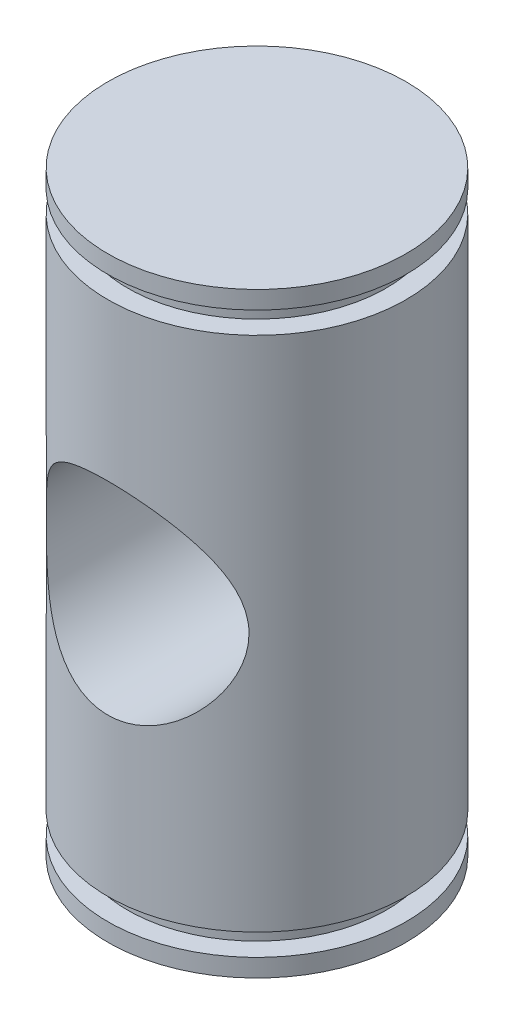
ISO-10303-21;
HEADER;
FILE_DESCRIPTION(('STEP AP214'),'2;1');
FILE_NAME('part.step','',(''),(''),'','','');
FILE_SCHEMA(('AUTOMOTIVE_DESIGN { 1 0 10303 214 1 1 1 1 }'));
ENDSEC;
DATA;
#1=APPLICATION_CONTEXT('core data for automotive mechanical design processes');
#2=APPLICATION_PROTOCOL_DEFINITION('international standard','automotive_design',2000,#1);
#3=PRODUCT_CONTEXT('',#1,'mechanical');
#4=PRODUCT('Part','Part','',(#3));
#5=PRODUCT_RELATED_PRODUCT_CATEGORY('part','',(#4));
#6=PRODUCT_DEFINITION_FORMATION('','',#4);
#7=PRODUCT_DEFINITION_CONTEXT('part definition',#1,'design');
#8=PRODUCT_DEFINITION('design','',#6,#7);
#9=PRODUCT_DEFINITION_SHAPE('','',#8);
#10=(LENGTH_UNIT() NAMED_UNIT(*) SI_UNIT(.MILLI.,.METRE.));
#11=(NAMED_UNIT(*) PLANE_ANGLE_UNIT() SI_UNIT($,.RADIAN.));
#12=(NAMED_UNIT(*) SI_UNIT($,.STERADIAN.) SOLID_ANGLE_UNIT());
#13=UNCERTAINTY_MEASURE_WITH_UNIT(LENGTH_MEASURE(1.E-05),#10,'distance_accuracy_value','');
#14=(GEOMETRIC_REPRESENTATION_CONTEXT(3) GLOBAL_UNCERTAINTY_ASSIGNED_CONTEXT((#13)) GLOBAL_UNIT_ASSIGNED_CONTEXT((#10,
#11,#12)) REPRESENTATION_CONTEXT('',''));
#15=CARTESIAN_POINT('',(0.,0.,0.));
#16=DIRECTION('',(0.,0.,1.));
#17=DIRECTION('',(1.,0.,0.));
#18=AXIS2_PLACEMENT_3D('',#15,#16,#17);
#19=CARTESIAN_POINT('',(0.,24.,0.));
#20=DIRECTION('',(0.,-1.,0.));
#21=DIRECTION('',(0.,0.,-1.));
#22=AXIS2_PLACEMENT_3D('',#19,#20,#21);
#23=CYLINDRICAL_SURFACE('',#22,7.5);
#24=CARTESIAN_POINT('',(0.,17.1,-7.5));
#25=CARTESIAN_POINT('',(-0.127566730210158,17.0999994927697,-7.4999995232582));
#26=CARTESIAN_POINT('',(-0.255141212777439,17.0952067984768,-7.49673811939733));
#27=CARTESIAN_POINT('',(-0.509248840360519,17.0761111027231,-7.48377281472617));
#28=CARTESIAN_POINT('',(-0.635781903448471,17.0618073601383,-7.47406841186195));
#29=CARTESIAN_POINT('',(-0.886852602958205,17.0239045221269,-7.4484509526827));
#30=CARTESIAN_POINT('',(-1.01138950096724,17.0003020659397,-7.43253565163154));
#31=CARTESIAN_POINT('',(-1.25756849452188,16.9441350534012,-7.39486565882096));
#32=CARTESIAN_POINT('',(-1.37920936892341,16.9115667867568,-7.37310854965662));
#33=CARTESIAN_POINT('',(-1.61812798463224,16.838098298266,-7.32437318225181));
#34=CARTESIAN_POINT('',(-1.73542563216593,16.7972437126043,-7.29742356034956));
#35=CARTESIAN_POINT('',(-1.96573111337874,16.7075676353014,-7.23878773296998));
#36=CARTESIAN_POINT('',(-2.07873725088865,16.6587430331807,-7.20709967861906));
#37=CARTESIAN_POINT('',(-2.41041806838491,16.5010806974564,-7.1058561150041));
#38=CARTESIAN_POINT('',(-2.62196918942367,16.3809875400407,-7.03007586157716));
#39=CARTESIAN_POINT('',(-3.04015450725819,16.1031629847138,-6.86023456785428));
#40=CARTESIAN_POINT('',(-3.2447875004321,15.9430772904534,-6.76516011965005));
#41=CARTESIAN_POINT('',(-3.62626002576161,15.595404388787,-6.56858301036921));
#42=CARTESIAN_POINT('',(-3.80305812367292,15.4077769709468,-6.46707107589219));
#43=CARTESIAN_POINT('',(-4.05915220570279,15.0912371470647,-6.30758792049528));
#44=CARTESIAN_POINT('',(-4.14836195548589,14.970469609277,-6.24911315974463));
#45=CARTESIAN_POINT('',(-4.31622565963556,14.7208181640917,-6.13437409208585));
#46=CARTESIAN_POINT('',(-4.39487707912488,14.5919323184984,-6.07811031828343));
#47=CARTESIAN_POINT('',(-4.61393463355384,14.1938808227036,-5.91561181692743));
#48=CARTESIAN_POINT('',(-4.73796392687913,13.9126829194577,-5.81532969123793));
#49=CARTESIAN_POINT('',(-4.90568631373639,13.4112715647167,-5.6738535566743));
#50=CARTESIAN_POINT('',(-4.96230524005851,13.1978552916999,-5.62395673680471));
#51=CARTESIAN_POINT('',(-5.02634150626474,12.8707770584797,-5.56656756646093));
#52=CARTESIAN_POINT('',(-5.04420235416821,12.7606310641808,-5.55034976483986));
#53=CARTESIAN_POINT('',(-5.07270410383868,12.5386778797341,-5.52431518380449));
#54=CARTESIAN_POINT('',(-5.08334766221265,12.426871316327,-5.51449604916135));
#55=CARTESIAN_POINT('',(-5.09725701763249,12.2018485591129,-5.50164158369271));
#56=CARTESIAN_POINT('',(-5.10048585617087,12.0886281200459,-5.49864023677857));
#57=CARTESIAN_POINT('',(-5.09939588911292,11.8622558721054,-5.49965110286675));
#58=CARTESIAN_POINT('',(-5.09507708047514,11.7491040632596,-5.50366331869529));
#59=CARTESIAN_POINT('',(-5.07897051252735,11.5237401243872,-5.51853045455466));
#60=CARTESIAN_POINT('',(-5.06717957560727,11.4115284147291,-5.52938828575355));
#61=CARTESIAN_POINT('',(-5.03634428460785,11.1888982139649,-5.55748709063105));
#62=CARTESIAN_POINT('',(-5.01729689957282,11.0784804923136,-5.57473073152304));
#63=CARTESIAN_POINT('',(-4.95209879014997,10.7625846806445,-5.63294148366203));
#64=CARTESIAN_POINT('',(-4.89693365040974,10.5602635141615,-5.68134319155892));
#65=CARTESIAN_POINT('',(-4.7639995139934,10.1676774097148,-5.79325354551575));
#66=CARTESIAN_POINT('',(-4.68621300254279,9.97742195328287,-5.85677389035357));
#67=CARTESIAN_POINT('',(-4.5326114762077,9.65726362028585,-5.97598027806196));
#68=CARTESIAN_POINT('',(-4.46134624038017,9.52433679281399,-6.02953727773034));
#69=CARTESIAN_POINT('',(-4.30806334839154,9.26630091753426,-6.13999251867954));
#70=CARTESIAN_POINT('',(-4.22604553958328,9.14119198074904,-6.19689080738809));
#71=CARTESIAN_POINT('',(-4.05159509981907,8.89888641538432,-6.31233240965471));
#72=CARTESIAN_POINT('',(-3.95914363036821,8.78170473003148,-6.37087855073661));
#73=CARTESIAN_POINT('',(-3.76433311330421,8.55587026169253,-6.48788915816264));
#74=CARTESIAN_POINT('',(-3.66197522745005,8.4472164813101,-6.54635363327024));
#75=CARTESIAN_POINT('',(-3.44671491383834,8.23796799070864,-6.66222409680994));
#76=CARTESIAN_POINT('',(-3.33372690448862,8.13745343281274,-6.71961607151097));
#77=CARTESIAN_POINT('',(-3.09835160633043,7.94621117557695,-6.83133836098213));
#78=CARTESIAN_POINT('',(-2.9759655286723,7.85548221875608,-6.88566906870529));
#79=CARTESIAN_POINT('',(-2.72244284072097,7.68472214908,-6.98978199090739));
#80=CARTESIAN_POINT('',(-2.59132125182581,7.60467334819017,-7.03957168163614));
#81=CARTESIAN_POINT('',(-2.32078317136895,7.45601850488418,-7.13333310693482));
#82=CARTESIAN_POINT('',(-2.18136919217295,7.38740902038798,-7.17730659076999));
#83=CARTESIAN_POINT('',(-1.92686478635842,7.27644574996576,-7.24917926671467));
#84=CARTESIAN_POINT('',(-1.81323196464627,7.23164305034019,-7.27848099281239));
#85=CARTESIAN_POINT('',(-1.58202053924471,7.15002755014502,-7.33220894429242));
#86=CARTESIAN_POINT('',(-1.46444271393283,7.1132131839998,-7.35663612492606));
#87=CARTESIAN_POINT('',(-1.2260224606973,7.04801671254319,-7.40010461124119));
#88=CARTESIAN_POINT('',(-1.10518081384602,7.01963260893451,-7.4191471932288));
#89=CARTESIAN_POINT('',(-0.861049766239558,6.97167430400485,-7.45142567103361));
#90=CARTESIAN_POINT('',(-0.737761512955199,6.9520960700932,-7.46466422469749));
#91=CARTESIAN_POINT('',(-0.489101139016054,6.92195665297877,-7.48507852394856));
#92=CARTESIAN_POINT('',(-0.3637228290406,6.91143042612677,-7.49223076477686));
#93=CARTESIAN_POINT('',(-0.1123754220696,6.89968688450283,-7.50021167992905));
#94=CARTESIAN_POINT('',(0.0135934372558473,6.89846610083628,-7.50104271068121));
#95=CARTESIAN_POINT('',(0.265186676100003,6.90534433395875,-7.4963664539054));
#96=CARTESIAN_POINT('',(0.390810968234129,6.91344552884663,-7.49085768507059));
#97=CARTESIAN_POINT('',(0.640689350550038,6.93884502062835,-7.47363385631711));
#98=CARTESIAN_POINT('',(0.764943474166071,6.95614309259487,-7.46191894818155));
#99=CARTESIAN_POINT('',(1.00457509422583,6.99851724611934,-7.43334366115526));
#100=CARTESIAN_POINT('',(1.12007206994069,7.02312818610106,-7.41679176809096));
#101=CARTESIAN_POINT('',(1.34832722668319,7.08005389476483,-7.37871447292753));
#102=CARTESIAN_POINT('',(1.4610845052842,7.11237116491677,-7.35718745597641));
#103=CARTESIAN_POINT('',(1.79423202227296,7.22034229656798,-7.28575148830959));
#104=CARTESIAN_POINT('',(2.00968263945377,7.30704881960708,-7.22896465089334));
#105=CARTESIAN_POINT('',(2.4399679186831,7.51466318840058,-7.09587153167287));
#106=CARTESIAN_POINT('',(2.65335288012816,7.63776461845217,-7.01836077021799));
#107=CARTESIAN_POINT('',(3.05740511094924,7.91077141145693,-6.85201208837707));
#108=CARTESIAN_POINT('',(3.24805485777835,8.06069722889869,-6.7631655390122));
#109=CARTESIAN_POINT('',(3.63478077583375,8.41147301601969,-6.56453831392151));
#110=CARTESIAN_POINT('',(3.82641745045037,8.61664641906045,-6.45374379836046));
#111=CARTESIAN_POINT('',(4.17422098061933,9.05644400991991,-6.23443119554039));
#112=CARTESIAN_POINT('',(4.33037238922449,9.29108095465659,-6.12591411824859));
#113=CARTESIAN_POINT('',(4.58482403610952,9.75302960471253,-5.9372457430984));
#114=CARTESIAN_POINT('',(4.68815464405302,9.97680165307353,-5.85524903904975));
#115=CARTESIAN_POINT('',(4.86267572421545,10.4424665471858,-5.71115225734429));
#116=CARTESIAN_POINT('',(4.93392934581856,10.68432268619,-5.64901315701445));
#117=CARTESIAN_POINT('',(5.03156854501574,11.140681329729,-5.56209598200348));
#118=CARTESIAN_POINT('',(5.06340445355703,11.3531444724245,-5.53285535125835));
#119=CARTESIAN_POINT('',(5.09988778893923,11.7822799319448,-5.49925644490971));
#120=CARTESIAN_POINT('',(5.10455931238198,11.9989483471487,-5.4948761166604));
#121=CARTESIAN_POINT('',(5.08641912798999,12.4299553903438,-5.5116655050053));
#122=CARTESIAN_POINT('',(5.06362306205283,12.6442952742483,-5.53282067997419));
#123=CARTESIAN_POINT('',(4.9921021040988,13.0652051747589,-5.59742600224665));
#124=CARTESIAN_POINT('',(4.94334083165103,13.2717638530683,-5.64090742829697));
#125=CARTESIAN_POINT('',(4.80282149517219,13.7376921740086,-5.76141317263775));
#126=CARTESIAN_POINT('',(4.7022965389055,13.9928024854154,-5.84471923848015));
#127=CARTESIAN_POINT('',(4.52457953123839,14.3572337216815,-5.9819577215412));
#128=CARTESIAN_POINT('',(4.46076408829201,14.4757964941017,-6.02981203769062));
#129=CARTESIAN_POINT('',(4.32455180446817,14.7066956348769,-6.12823980727697));
#130=CARTESIAN_POINT('',(4.25215554883238,14.8190324270998,-6.1788130751434));
#131=CARTESIAN_POINT('',(4.01951211467638,15.150784897828,-6.33472141245388));
#132=CARTESIAN_POINT('',(3.84613599811439,15.3601959243096,-6.44236319615055));
#133=CARTESIAN_POINT('',(3.56225107692574,15.6522349841064,-6.60092483364332));
#134=CARTESIAN_POINT('',(3.46360063950101,15.7459406248371,-6.65331916343599));
#135=CARTESIAN_POINT('',(3.2584829665125,15.9256688537068,-6.75613988557255));
#136=CARTESIAN_POINT('',(3.15201453666973,16.0116902635329,-6.806565975438));
#137=CARTESIAN_POINT('',(2.9176396223219,16.1858459656964,-6.91055951982317));
#138=CARTESIAN_POINT('',(2.78872465801304,16.2728720757396,-6.96371795172151));
#139=CARTESIAN_POINT('',(2.52199109677087,16.435531807046,-7.06469244234633));
#140=CARTESIAN_POINT('',(2.38417684656728,16.5111709308708,-7.1125110785319));
#141=CARTESIAN_POINT('',(2.10056999736255,16.6499996164635,-7.20136490911293));
#142=CARTESIAN_POINT('',(1.95478895369255,16.7132066283411,-7.24240959841606));
#143=CARTESIAN_POINT('',(1.65618900681344,16.8262293190255,-7.31646529620441));
#144=CARTESIAN_POINT('',(1.50337339292219,16.876051183611,-7.34948001497008));
#145=CARTESIAN_POINT('',(1.23920976098486,16.9484387513939,-7.3977402294092));
#146=CARTESIAN_POINT('',(1.12928530756659,16.9746913370418,-7.41534055427439));
#147=CARTESIAN_POINT('',(0.907305677180581,17.0199220703817,-7.44575957877726));
#148=CARTESIAN_POINT('',(0.795250909775432,17.0389016017997,-7.45857918795177));
#149=CARTESIAN_POINT('',(0.569687947034436,17.06935947108,-7.47918978594514));
#150=CARTESIAN_POINT('',(0.456180023284695,17.0808391903326,-7.48698170081165));
#151=CARTESIAN_POINT('',(0.228449982132238,17.0961584885706,-7.49738621232472));
#152=CARTESIAN_POINT('',(0.114228099021864,17.1000004541933,-7.50000042689272));
#153=CARTESIAN_POINT('',(0.,17.1,-7.5));
#154=B_SPLINE_CURVE_WITH_KNOTS('',3,(#24,#25,#26,#27,#28,#29,#30,#31,#32,#33,#34,#35,#36,#37,
#38,#39,#40,#41,#42,#43,#44,#45,#46,#47,#48,#49,#50,#51,#52,#53,#54,#55,#56,#57,#58,#59,#60,#61,
#62,#63,#64,#65,#66,#67,#68,#69,#70,#71,#72,#73,#74,#75,#76,#77,#78,#79,#80,#81,#82,#83,#84,#85,
#86,#87,#88,#89,#90,#91,#92,#93,#94,#95,#96,#97,#98,#99,#100,#101,#102,#103,#104,#105,#106,#107,
#108,#109,#110,#111,#112,#113,#114,#115,#116,#117,#118,#119,#120,#121,#122,#123,#124,#125,#126,
#127,#128,#129,#130,#131,#132,#133,#134,#135,#136,#137,#138,#139,#140,#141,#142,#143,#144,#145,
#146,#147,#148,#149,#150,#151,#152,#153),.UNSPECIFIED.,.T.,.F.,(4,2,2,2,2,2,2,2,2,2,2,2,2,2,2,2,
2,2,2,2,2,2,2,2,2,2,2,2,2,2,2,2,2,2,2,2,2,2,2,2,2,2,2,2,2,2,2,2,2,2,2,2,2,2,2,2,2,2,2,2,2,2,2,2,
4),(0.,0.382583141590157,0.765196098475823,1.14794746718391,1.53085746740599,1.91171325139345,
2.29271802991108,3.05404881937724,3.88110644920519,4.70938380510365,5.19224676493767,
5.67522544549461,6.6385431192422,7.31480074218911,7.65269734240483,7.99046949888721,
8.32992165255371,8.66937394300727,9.00897068648304,9.34870943238132,9.99181269480681,
10.6354152167206,11.1149939965721,11.5945795854236,12.075045378313,12.5554548934715,
13.0401314046674,13.5247455589917,14.0085468796975,14.4922023612675,14.8686596106289,
15.2450430140901,15.6213371288376,15.9974587462582,16.3750264013722,16.7524532994625,
17.1299684020085,17.5074742721206,17.8648029217323,18.2222477182658,18.9365764227754,
19.7084883030172,20.480991320035,21.3828820588251,22.2851646471648,23.0616496952177,
23.836599333631,24.4841536925998,25.1311335403942,25.7777451282984,26.4252650912416,
27.2800504095095,27.7084209656309,28.1367623221647,29.0101153906508,29.4472032329206,
29.8843579843313,30.3767889095179,30.8689811069411,31.3604774386671,31.8517462392528,
32.1945612285007,32.537310963476,32.8799975495719,33.2225770364777),.UNSPECIFIED.);
#155=CARTESIAN_POINT('',(0.,17.1,-7.5));
#156=VERTEX_POINT('',#155);
#157=EDGE_CURVE('E10',#156,#156,#154,.T.);
#158=ORIENTED_EDGE('',*,*,#157,.T.);
#159=EDGE_LOOP('',(#158));
#160=FACE_BOUND('',#159,.T.);
#161=CARTESIAN_POINT('',(5.1,12.,5.49909083394701));
#162=CARTESIAN_POINT('',(5.10000460461227,11.8763135565414,5.49908269677092));
#163=CARTESIAN_POINT('',(5.09549411689311,11.7526635055115,5.50327898444734));
#164=CARTESIAN_POINT('',(5.07756787972817,11.5065196431349,5.51982446461906));
#165=CARTESIAN_POINT('',(5.06414971947728,11.3840261539094,5.53217586423881));
#166=CARTESIAN_POINT('',(5.02866183095179,11.1411331571149,5.56445222653675));
#167=CARTESIAN_POINT('',(5.0065788304413,11.0207371592283,5.58438880626913));
#168=CARTESIAN_POINT('',(4.95417519863365,10.7830435453275,5.63093014513941));
#169=CARTESIAN_POINT('',(4.92385021026666,10.6657476042257,5.6575384306505));
#170=CARTESIAN_POINT('',(4.82193417733257,10.3220314675793,5.74516411271));
#171=CARTESIAN_POINT('',(4.73897468950654,10.1009753563163,5.81439847219608));
#172=CARTESIAN_POINT('',(4.54597378607742,9.67649792883648,5.96650691751471));
#173=CARTESIAN_POINT('',(4.43592842680086,9.47307918643893,6.04938298898316));
#174=CARTESIAN_POINT('',(4.17091115618131,9.05301058696962,6.2356846586459));
#175=CARTESIAN_POINT('',(4.01153860941633,8.83961693658783,6.34025688922267));
#176=CARTESIAN_POINT('',(3.74907233737706,8.53992390829499,6.49653064030007));
#177=CARTESIAN_POINT('',(3.65759459137233,8.44335241241974,6.54856844526537));
#178=CARTESIAN_POINT('',(3.46697680729689,8.25729950823859,6.651449826628));
#179=CARTESIAN_POINT('',(3.36783515028412,8.16781960610648,6.70229314772585));
#180=CARTESIAN_POINT('',(3.14634256277193,7.98323698344429,6.80939800662233));
#181=CARTESIAN_POINT('',(3.02276671293973,7.88938464652511,6.86529086034837));
#182=CARTESIAN_POINT('',(2.766284941118,7.71258695644353,6.97258762426064));
#183=CARTESIAN_POINT('',(2.63338315789852,7.62963681135302,7.02399350328323));
#184=CARTESIAN_POINT('',(2.35900211472256,7.47564063371347,7.1208320283892));
#185=CARTESIAN_POINT('',(2.21753346180748,7.4045802743026,7.16627184897662));
#186=CARTESIAN_POINT('',(1.92680146304984,7.27530770655076,7.24984718671696));
#187=CARTESIAN_POINT('',(1.77754128399093,7.2170903278271,7.28798564246452));
#188=CARTESIAN_POINT('',(1.51164511066682,7.12770633409001,7.34700154664027));
#189=CARTESIAN_POINT('',(1.39646876529493,7.09343193806145,7.36979682983633));
#190=CARTESIAN_POINT('',(1.16313581876349,7.03294540475093,7.41020399483566));
#191=CARTESIAN_POINT('',(1.04497981746517,7.0067316585078,7.42781691104471));
#192=CARTESIAN_POINT('',(0.806495398035895,6.96271304613387,7.45747917390487));
#193=CARTESIAN_POINT('',(0.686168345533104,6.94490307304086,7.46953189937708));
#194=CARTESIAN_POINT('',(0.444103461720726,6.91791360802607,7.48782367043018));
#195=CARTESIAN_POINT('',(0.322365583783978,6.90873440217554,7.4940625233072));
#196=CARTESIAN_POINT('',(0.0781978918972981,6.89913388085577,7.50058815404189));
#197=CARTESIAN_POINT('',(-0.0442326950635858,6.89872596789607,7.50086582322753));
#198=CARTESIAN_POINT('',(-0.288716512320219,6.90670955746859,7.49543854910233));
#199=CARTESIAN_POINT('',(-0.41076959043464,6.91510423664854,7.4897314460284));
#200=CARTESIAN_POINT('',(-0.653528357511631,6.94057371201552,7.47246324208409));
#201=CARTESIAN_POINT('',(-0.774234220787737,6.95764737162249,7.46090290774071));
#202=CARTESIAN_POINT('',(-1.01351047724591,7.00024284512775,7.43218169214308));
#203=CARTESIAN_POINT('',(-1.13208002748937,7.02576791997693,7.41501864913811));
#204=CARTESIAN_POINT('',(-1.36404798137507,7.08437109242449,7.3758349504692));
#205=CARTESIAN_POINT('',(-1.47750186778966,7.11729602074139,7.35391307446828));
#206=CARTESIAN_POINT('',(-1.70098669985754,7.19058292980879,7.30545971023028));
#207=CARTESIAN_POINT('',(-1.81101642700824,7.23094752341219,7.27892660268982));
#208=CARTESIAN_POINT('',(-2.13509662598846,7.36258167062231,7.19313436803079));
#209=CARTESIAN_POINT('',(-2.34331209504955,7.46443627958563,7.12765184865289));
#210=CARTESIAN_POINT('',(-2.76323980396284,7.70585131726737,6.97638010761738));
#211=CARTESIAN_POINT('',(-2.97270110346563,7.84836764999786,6.88913397927922));
#212=CARTESIAN_POINT('',(-3.36625345015285,8.16053384808122,6.70563174715268));
#213=CARTESIAN_POINT('',(-3.55031482655571,8.33021495451367,6.60936532300854));
#214=CARTESIAN_POINT('',(-3.82037643857189,8.61828920207312,6.45507077306023));
#215=CARTESIAN_POINT('',(-3.91538330024136,8.72876189555326,6.39774468977129));
#216=CARTESIAN_POINT('',(-4.09577288706636,8.95765144193501,6.28379214734697));
#217=CARTESIAN_POINT('',(-4.18115361880749,9.07606993221224,6.22716583527662));
#218=CARTESIAN_POINT('',(-4.42217385182584,9.44268058323265,6.06071745490885));
#219=CARTESIAN_POINT('',(-4.56297965281554,9.70253477620241,5.95415373363462));
#220=CARTESIAN_POINT('',(-4.7716346197338,10.1852829775739,5.78748855900727));
#221=CARTESIAN_POINT('',(-4.84886427797169,10.4023588631214,5.72236028159891));
#222=CARTESIAN_POINT('',(-4.94272852067526,10.7378878173817,5.64102215296258));
#223=CARTESIAN_POINT('',(-4.97034761834525,10.8513434189039,5.61664062275216));
#224=CARTESIAN_POINT('',(-5.01788417166924,11.0809946835393,5.57421393408946));
#225=CARTESIAN_POINT('',(-5.03780522093409,11.1971890412001,5.5561658194281));
#226=CARTESIAN_POINT('',(-5.06974068099082,11.432585837661,5.52704291840694));
#227=CARTESIAN_POINT('',(-5.08168443276098,11.551805695219,5.51603048697424));
#228=CARTESIAN_POINT('',(-5.0971383516588,11.7912569231005,5.50175362491153));
#229=CARTESIAN_POINT('',(-5.10064869417142,11.9114882723364,5.49848903315398));
#230=CARTESIAN_POINT('',(-5.09915459888304,12.1518582579984,5.49987506261168));
#231=CARTESIAN_POINT('',(-5.09415010202212,12.2719968937757,5.50452573872815));
#232=CARTESIAN_POINT('',(-5.07574872601831,12.5110470554682,5.52149611155026));
#233=CARTESIAN_POINT('',(-5.06235203296726,12.6299586085337,5.53381563820377));
#234=CARTESIAN_POINT('',(-5.01394438270629,12.9564122470244,5.57782843515278));
#235=CARTESIAN_POINT('',(-4.97023357997514,13.1617200252315,5.61713514285));
#236=CARTESIAN_POINT('',(-4.85951292967074,13.56152875368,5.71318186257865));
#237=CARTESIAN_POINT('',(-4.79248145288607,13.7560194765282,5.76993805276814));
#238=CARTESIAN_POINT('',(-4.60204648701026,14.2178124594074,5.92385513857337));
#239=CARTESIAN_POINT('',(-4.46686472018767,14.4781216703459,6.02766549924317));
#240=CARTESIAN_POINT('',(-4.23449818090627,14.8460798942347,6.19096898076404));
#241=CARTESIAN_POINT('',(-4.15197831788591,14.9651277503636,6.24674891960726));
#242=CARTESIAN_POINT('',(-3.97739552072166,15.1954956755873,6.35933219212204));
#243=CARTESIAN_POINT('',(-3.88533363301026,15.3068165898315,6.41613541301141));
#244=CARTESIAN_POINT('',(-3.59256996488056,15.6317002210038,6.58748315141836));
#245=CARTESIAN_POINT('',(-3.37739050774933,15.8328594926527,6.70141952857111));
#246=CARTESIAN_POINT('',(-2.91193670783144,16.1973561710529,6.91637630286297));
#247=CARTESIAN_POINT('',(-2.66171855762127,16.3607530477525,7.01741689493214));
#248=CARTESIAN_POINT('',(-2.17659110175977,16.6188696094117,7.18093646412576));
#249=CARTESIAN_POINT('',(-1.94670392224416,16.7206097963479,7.24707101648148));
#250=CARTESIAN_POINT('',(-1.58934337191022,16.8476832173186,7.33069165272678));
#251=CARTESIAN_POINT('',(-1.46810302822269,16.8857912098906,7.35597270143961));
#252=CARTESIAN_POINT('',(-1.22214586486894,16.9530380351904,7.40080746632262));
#253=CARTESIAN_POINT('',(-1.09743051812428,16.982180606799,7.42036356982145));
#254=CARTESIAN_POINT('',(-0.844718241841339,17.0312133572231,7.45337364319285));
#255=CARTESIAN_POINT('',(-0.716707700455818,17.0510550201435,7.46679560694014));
#256=CARTESIAN_POINT('',(-0.459025885958936,17.0809561589745,7.48705508556641));
#257=CARTESIAN_POINT('',(-0.329354609127959,17.0910156129718,7.49389258569529));
#258=CARTESIAN_POINT('',(-0.0694639327943321,17.101184530865,7.50080460275524));
#259=CARTESIAN_POINT('',(0.0607553685921697,17.1012957059097,7.50088028274968));
#260=CARTESIAN_POINT('',(0.32064206904375,17.0915712114269,7.49427013311879));
#261=CARTESIAN_POINT('',(0.450309498396962,17.0817360950347,7.48758467949504));
#262=CARTESIAN_POINT('',(0.697452219249458,17.0534874417823,7.46844271207676));
#263=CARTESIAN_POINT('',(0.815056321841354,17.0358424098987,7.45650366606455));
#264=CARTESIAN_POINT('',(1.04812782757318,16.9925445411401,7.42733135196229));
#265=CARTESIAN_POINT('',(1.16359449741636,16.9668890080975,7.41009630137861));
#266=CARTESIAN_POINT('',(1.5056418276375,16.878359175449,7.3509464815239));
#267=CARTESIAN_POINT('',(1.72806302120244,16.8038989495395,7.30157127719353));
#268=CARTESIAN_POINT('',(2.16763290382866,16.6228555683455,7.18372092761508));
#269=CARTESIAN_POINT('',(2.3839600675728,16.5148507617835,7.11441327331988));
#270=CARTESIAN_POINT('',(2.79592425840511,16.2720029630128,6.96283071845113));
#271=CARTESIAN_POINT('',(2.99155609916418,16.1371532676544,6.88055258022706));
#272=CARTESIAN_POINT('',(3.38930231031612,15.82061301829,6.69463336910008));
#273=CARTESIAN_POINT('',(3.58757947423273,15.6348897253291,6.58966908548014));
#274=CARTESIAN_POINT('',(3.95233622707818,15.2345841719757,6.37758471707086));
#275=CARTESIAN_POINT('',(4.11874331386666,15.0199379587204,6.27046031548908));
#276=CARTESIAN_POINT('',(4.3521112483352,14.663244567424,6.10898652256601));
#277=CARTESIAN_POINT('',(4.43091399601151,14.5300535188739,6.05188704736048));
#278=CARTESIAN_POINT('',(4.57679725179677,14.2554598366981,5.94232564385173));
#279=CARTESIAN_POINT('',(4.64387434214252,14.1140548248361,5.88986506987751));
#280=CARTESIAN_POINT('',(4.76521411228979,13.8240989097549,5.79213195345581));
#281=CARTESIAN_POINT('',(4.81952288518586,13.675576115051,5.74683375537241));
#282=CARTESIAN_POINT('',(4.91460144456236,13.371852895662,5.66573929129414));
#283=CARTESIAN_POINT('',(4.95538342232582,13.2166586270801,5.62993447507923));
#284=CARTESIAN_POINT('',(5.02539316094434,12.8867438564745,5.56757058755988));
#285=CARTESIAN_POINT('',(5.05326524829844,12.7115166777585,5.54212157923682));
#286=CARTESIAN_POINT('',(5.09056065200409,12.3574997689906,5.50789181771324));
#287=CARTESIAN_POINT('',(5.09999334689421,12.1787118967281,5.4991025911787));
#288=CARTESIAN_POINT('',(5.1,12.,5.49909083394701));
#289=B_SPLINE_CURVE_WITH_KNOTS('',3,(#161,#162,#163,#164,#165,#166,#167,#168,#169,#170,#171,
#172,#173,#174,#175,#176,#177,#178,#179,#180,#181,#182,#183,#184,#185,#186,#187,#188,#189,#190,
#191,#192,#193,#194,#195,#196,#197,#198,#199,#200,#201,#202,#203,#204,#205,#206,#207,#208,#209,
#210,#211,#212,#213,#214,#215,#216,#217,#218,#219,#220,#221,#222,#223,#224,#225,#226,#227,#228,
#229,#230,#231,#232,#233,#234,#235,#236,#237,#238,#239,#240,#241,#242,#243,#244,#245,#246,#247,
#248,#249,#250,#251,#252,#253,#254,#255,#256,#257,#258,#259,#260,#261,#262,#263,#264,#265,#266,
#267,#268,#269,#270,#271,#272,#273,#274,#275,#276,#277,#278,#279,#280,#281,#282,#283,#284,#285,
#286,#287,#288),.UNSPECIFIED.,.T.,.F.,(4,2,2,2,2,2,2,2,2,2,2,2,2,2,2,2,2,2,2,2,2,2,2,2,2,2,2,2,
2,2,2,2,2,2,2,2,2,2,2,2,2,2,2,2,2,2,2,2,2,2,2,2,2,2,2,2,2,2,2,2,2,2,2,4),(0.,0.370845908891976,
0.741792225819042,1.11330896616629,1.48502248956357,2.21994997130406,2.95498452105152,
3.80994381258096,4.23815210410421,4.66645109981835,5.16059462802471,5.65452022976979,
6.14784631047133,6.64097342191127,7.00752831887334,7.37401000138958,7.74026868571305,
8.1065395094425,8.47336995420202,8.84033282498476,9.20724765149783,9.57430421619677,
9.93436744557052,10.2945573730047,11.0143964162593,11.8153683025165,12.6172680596107,
13.086544033074,13.5559170081265,14.4933134058128,15.2087433923703,15.5662175217049,
15.9235245724232,16.2839559272714,16.6443797863626,17.0048061454058,17.365224512497,
18.0030778686599,18.6415243983665,19.5695907292873,20.0348871560787,20.5001326097089,
21.4431570982932,22.3846861918402,23.1609503578923,23.5492765644046,23.9374406056652,
24.3276074762616,24.7177752208834,25.1078758547752,25.4979547955018,25.8560877174927,
26.2143413097295,26.9302698984271,27.6820429521285,28.4340039590153,29.3044712465499,
30.1768958557462,30.6711934951896,31.1656349718185,31.6582631458024,32.1504461150825,
32.6865461762998,33.222373498347),.UNSPECIFIED.);
#290=CARTESIAN_POINT('',(5.1,12.,5.49909083394701));
#291=VERTEX_POINT('',#290);
#292=EDGE_CURVE('E40',#291,#291,#289,.T.);
#293=ORIENTED_EDGE('',*,*,#292,.T.);
#294=EDGE_LOOP('',(#293));
#295=FACE_BOUND('',#294,.T.);
#296=CARTESIAN_POINT('',(0.,-1.,0.));
#297=DIRECTION('',(0.,-1.,0.));
#298=DIRECTION('',(0.,0.,-1.));
#299=AXIS2_PLACEMENT_3D('',#296,#297,#298);
#300=CIRCLE('',#299,7.5);
#301=CARTESIAN_POINT('',(0.,-1.,-7.5));
#302=VERTEX_POINT('',#301);
#303=EDGE_CURVE('E44',#302,#302,#300,.T.);
#304=ORIENTED_EDGE('',*,*,#303,.F.);
#305=EDGE_LOOP('',(#304));
#306=FACE_BOUND('',#305,.T.);
#307=CARTESIAN_POINT('',(0.,25.,0.));
#308=DIRECTION('',(0.,-1.,0.));
#309=DIRECTION('',(0.,0.,-1.));
#310=AXIS2_PLACEMENT_3D('',#307,#308,#309);
#311=CIRCLE('',#310,7.5);
#312=CARTESIAN_POINT('',(0.,25.,-7.5));
#313=VERTEX_POINT('',#312);
#314=EDGE_CURVE('E110',#313,#313,#311,.T.);
#315=ORIENTED_EDGE('',*,*,#314,.T.);
#316=EDGE_LOOP('',(#315));
#317=FACE_BOUND('',#316,.T.);
#318=ADVANCED_FACE('F30',(#160,#295,#306,#317),#23,.T.);
#319=CARTESIAN_POINT('',(0.,12.,-7.5));
#320=DIRECTION('',(0.,0.,1.));
#321=DIRECTION('',(1.,0.,0.));
#322=AXIS2_PLACEMENT_3D('',#319,#320,#321);
#323=CYLINDRICAL_SURFACE('',#322,5.1);
#324=ORIENTED_EDGE('',*,*,#292,.F.);
#325=EDGE_LOOP('',(#324));
#326=FACE_BOUND('',#325,.T.);
#327=ORIENTED_EDGE('',*,*,#157,.F.);
#328=EDGE_LOOP('',(#327));
#329=FACE_BOUND('',#328,.T.);
#330=ADVANCED_FACE('F54',(#326,#329),#323,.F.);
#331=CARTESIAN_POINT('',(-7.5,-1.,0.));
#332=DIRECTION('',(0.,1.,0.));
#333=DIRECTION('',(0.,0.,1.));
#334=AXIS2_PLACEMENT_3D('',#331,#332,#333);
#335=PLANE('',#334);
#336=CARTESIAN_POINT('',(0.,-1.,0.));
#337=DIRECTION('',(0.,-1.,0.));
#338=DIRECTION('',(0.,0.,-1.));
#339=AXIS2_PLACEMENT_3D('',#336,#337,#338);
#340=CIRCLE('',#339,6.49999999999999);
#341=CARTESIAN_POINT('',(0.,-1.,-6.49999999999999));
#342=VERTEX_POINT('',#341);
#343=EDGE_CURVE('E48',#342,#342,#340,.T.);
#344=ORIENTED_EDGE('',*,*,#343,.F.);
#345=EDGE_LOOP('',(#344));
#346=FACE_BOUND('',#345,.T.);
#347=ORIENTED_EDGE('',*,*,#303,.T.);
#348=EDGE_LOOP('',(#347));
#349=FACE_BOUND('',#348,.T.);
#350=ADVANCED_FACE('F58',(#346,#349),#335,.F.);
#351=CARTESIAN_POINT('',(0.,0.,0.));
#352=DIRECTION('',(0.,-1.,0.));
#353=DIRECTION('',(0.,0.,-1.));
#354=AXIS2_PLACEMENT_3D('',#351,#352,#353);
#355=CYLINDRICAL_SURFACE('',#354,6.5);
#356=CARTESIAN_POINT('',(0.,-2.1,0.));
#357=DIRECTION('',(0.,-1.,0.));
#358=DIRECTION('',(0.,0.,-1.));
#359=AXIS2_PLACEMENT_3D('',#356,#357,#358);
#360=CIRCLE('',#359,6.5);
#361=CARTESIAN_POINT('',(0.,-2.1,-6.5));
#362=VERTEX_POINT('',#361);
#363=EDGE_CURVE('E124',#362,#362,#360,.T.);
#364=ORIENTED_EDGE('',*,*,#363,.F.);
#365=EDGE_LOOP('',(#364));
#366=FACE_BOUND('',#365,.T.);
#367=ORIENTED_EDGE('',*,*,#343,.T.);
#368=EDGE_LOOP('',(#367));
#369=FACE_BOUND('',#368,.T.);
#370=ADVANCED_FACE('F63',(#366,#369),#355,.T.);
#371=CARTESIAN_POINT('',(-6.5,-2.1,0.));
#372=DIRECTION('',(0.,-1.,0.));
#373=DIRECTION('',(0.,0.,-1.));
#374=AXIS2_PLACEMENT_3D('',#371,#372,#373);
#375=PLANE('',#374);
#376=CARTESIAN_POINT('',(0.,-2.1,0.));
#377=DIRECTION('',(0.,-1.,0.));
#378=DIRECTION('',(0.,0.,-1.));
#379=AXIS2_PLACEMENT_3D('',#376,#377,#378);
#380=CIRCLE('',#379,7.49999999999998);
#381=CARTESIAN_POINT('',(0.,-2.1,-7.49999999999998));
#382=VERTEX_POINT('',#381);
#383=EDGE_CURVE('E115',#382,#382,#380,.T.);
#384=ORIENTED_EDGE('',*,*,#383,.F.);
#385=EDGE_LOOP('',(#384));
#386=FACE_BOUND('',#385,.T.);
#387=ORIENTED_EDGE('',*,*,#363,.T.);
#388=EDGE_LOOP('',(#387));
#389=FACE_BOUND('',#388,.T.);
#390=ADVANCED_FACE('F67',(#386,#389),#375,.F.);
#391=CARTESIAN_POINT('',(0.,0.,0.));
#392=DIRECTION('',(0.,-1.,0.));
#393=DIRECTION('',(0.,0.,-1.));
#394=AXIS2_PLACEMENT_3D('',#391,#392,#393);
#395=CYLINDRICAL_SURFACE('',#394,7.49999999999999);
#396=CARTESIAN_POINT('',(0.,-3.,0.));
#397=DIRECTION('',(0.,-1.,0.));
#398=DIRECTION('',(0.,0.,-1.));
#399=AXIS2_PLACEMENT_3D('',#396,#397,#398);
#400=CIRCLE('',#399,7.5);
#401=CARTESIAN_POINT('',(0.,-3.,-7.5));
#402=VERTEX_POINT('',#401);
#403=EDGE_CURVE('E111',#402,#402,#400,.T.);
#404=ORIENTED_EDGE('',*,*,#403,.F.);
#405=EDGE_LOOP('',(#404));
#406=FACE_BOUND('',#405,.T.);
#407=ORIENTED_EDGE('',*,*,#383,.T.);
#408=EDGE_LOOP('',(#407));
#409=FACE_BOUND('',#408,.T.);
#410=ADVANCED_FACE('F71',(#406,#409),#395,.T.);
#411=CARTESIAN_POINT('',(-7.5,-3.,0.));
#412=DIRECTION('',(0.,1.,0.));
#413=DIRECTION('',(0.,0.,1.));
#414=AXIS2_PLACEMENT_3D('',#411,#412,#413);
#415=PLANE('',#414);
#416=ORIENTED_EDGE('',*,*,#403,.T.);
#417=EDGE_LOOP('',(#416));
#418=FACE_BOUND('',#417,.T.);
#419=ADVANCED_FACE('F75',(#418),#415,.F.);
#420=CARTESIAN_POINT('',(-7.5,25.,0.));
#421=DIRECTION('',(0.,-1.,0.));
#422=DIRECTION('',(0.,0.,-1.));
#423=AXIS2_PLACEMENT_3D('',#420,#421,#422);
#424=PLANE('',#423);
#425=ORIENTED_EDGE('',*,*,#314,.F.);
#426=EDGE_LOOP('',(#425));
#427=FACE_BOUND('',#426,.T.);
#428=CARTESIAN_POINT('',(0.,25.,0.));
#429=DIRECTION('',(0.,-1.,0.));
#430=DIRECTION('',(0.,0.,-1.));
#431=AXIS2_PLACEMENT_3D('',#428,#429,#430);
#432=CIRCLE('',#431,6.5);
#433=CARTESIAN_POINT('',(0.,25.,-6.5));
#434=VERTEX_POINT('',#433);
#435=EDGE_CURVE('E112',#434,#434,#432,.T.);
#436=ORIENTED_EDGE('',*,*,#435,.T.);
#437=EDGE_LOOP('',(#436));
#438=FACE_BOUND('',#437,.T.);
#439=ADVANCED_FACE('F79',(#427,#438),#424,.F.);
#440=CARTESIAN_POINT('',(0.,0.,0.));
#441=DIRECTION('',(0.,-1.,0.));
#442=DIRECTION('',(0.,0.,-1.));
#443=AXIS2_PLACEMENT_3D('',#440,#441,#442);
#444=CYLINDRICAL_SURFACE('',#443,6.5);
#445=ORIENTED_EDGE('',*,*,#435,.F.);
#446=EDGE_LOOP('',(#445));
#447=FACE_BOUND('',#446,.T.);
#448=CARTESIAN_POINT('',(0.,26.1,0.));
#449=DIRECTION('',(0.,-1.,0.));
#450=DIRECTION('',(0.,0.,-1.));
#451=AXIS2_PLACEMENT_3D('',#448,#449,#450);
#452=CIRCLE('',#451,6.5);
#453=CARTESIAN_POINT('',(0.,26.1,-6.5));
#454=VERTEX_POINT('',#453);
#455=EDGE_CURVE('E118',#454,#454,#452,.T.);
#456=ORIENTED_EDGE('',*,*,#455,.T.);
#457=EDGE_LOOP('',(#456));
#458=FACE_BOUND('',#457,.T.);
#459=ADVANCED_FACE('F83',(#447,#458),#444,.T.);
#460=CARTESIAN_POINT('',(-6.5,26.1,0.));
#461=DIRECTION('',(0.,1.,0.));
#462=DIRECTION('',(0.,0.,1.));
#463=AXIS2_PLACEMENT_3D('',#460,#461,#462);
#464=PLANE('',#463);
#465=ORIENTED_EDGE('',*,*,#455,.F.);
#466=EDGE_LOOP('',(#465));
#467=FACE_BOUND('',#466,.T.);
#468=CARTESIAN_POINT('',(0.,26.1,0.));
#469=DIRECTION('',(0.,-1.,0.));
#470=DIRECTION('',(0.,0.,-1.));
#471=AXIS2_PLACEMENT_3D('',#468,#469,#470);
#472=CIRCLE('',#471,7.5);
#473=CARTESIAN_POINT('',(0.,26.1,-7.5));
#474=VERTEX_POINT('',#473);
#475=EDGE_CURVE('E136',#474,#474,#472,.T.);
#476=ORIENTED_EDGE('',*,*,#475,.T.);
#477=EDGE_LOOP('',(#476));
#478=FACE_BOUND('',#477,.T.);
#479=ADVANCED_FACE('F87',(#467,#478),#464,.F.);
#480=CARTESIAN_POINT('',(0.,0.,0.));
#481=DIRECTION('',(0.,-1.,0.));
#482=DIRECTION('',(0.,0.,-1.));
#483=AXIS2_PLACEMENT_3D('',#480,#481,#482);
#484=CYLINDRICAL_SURFACE('',#483,7.5);
#485=ORIENTED_EDGE('',*,*,#475,.F.);
#486=EDGE_LOOP('',(#485));
#487=FACE_BOUND('',#486,.T.);
#488=CARTESIAN_POINT('',(0.,27.,0.));
#489=DIRECTION('',(0.,-1.,0.));
#490=DIRECTION('',(0.,0.,-1.));
#491=AXIS2_PLACEMENT_3D('',#488,#489,#490);
#492=CIRCLE('',#491,7.5);
#493=CARTESIAN_POINT('',(0.,27.,-7.5));
#494=VERTEX_POINT('',#493);
#495=EDGE_CURVE('E139',#494,#494,#492,.T.);
#496=ORIENTED_EDGE('',*,*,#495,.T.);
#497=EDGE_LOOP('',(#496));
#498=FACE_BOUND('',#497,.T.);
#499=ADVANCED_FACE('F91',(#487,#498),#484,.T.);
#500=CARTESIAN_POINT('',(-7.5,27.,0.));
#501=DIRECTION('',(0.,-1.,0.));
#502=DIRECTION('',(0.,0.,-1.));
#503=AXIS2_PLACEMENT_3D('',#500,#501,#502);
#504=PLANE('',#503);
#505=ORIENTED_EDGE('',*,*,#495,.F.);
#506=EDGE_LOOP('',(#505));
#507=FACE_BOUND('',#506,.T.);
#508=ADVANCED_FACE('F95',(#507),#504,.F.);
#509=CLOSED_SHELL('',(#318,#330,#350,#370,#390,#410,#419,#439,#459,#479,#499,#508));
#510=MANIFOLD_SOLID_BREP('B2',#509);
#511=ADVANCED_BREP_SHAPE_REPRESENTATION('',(#18,#510),#14);
#512=SHAPE_DEFINITION_REPRESENTATION(#9,#511);
ENDSEC;
END-ISO-10303-21;
